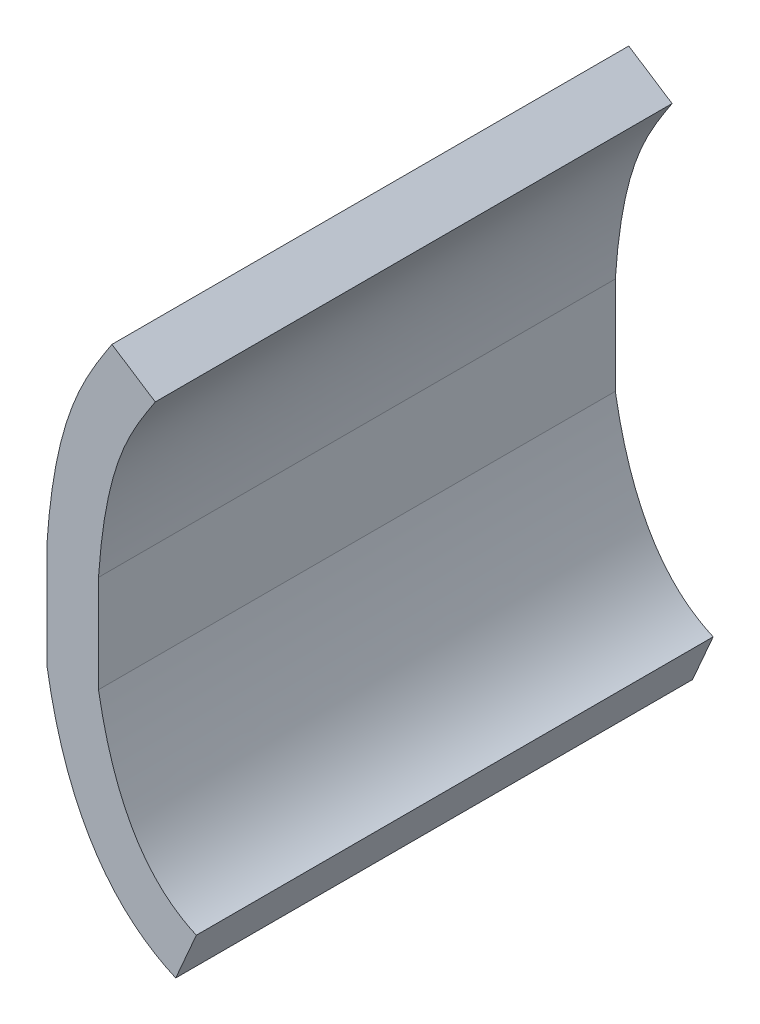
ISO-10303-21;
HEADER;
FILE_DESCRIPTION(('STEP AP214'),'2;1');
FILE_NAME('part.step','',(''),(''),'','','');
FILE_SCHEMA(('AUTOMOTIVE_DESIGN { 1 0 10303 214 1 1 1 1 }'));
ENDSEC;
DATA;
#1=APPLICATION_CONTEXT('core data for automotive mechanical design processes');
#2=APPLICATION_PROTOCOL_DEFINITION('international standard','automotive_design',2000,#1);
#3=PRODUCT_CONTEXT('',#1,'mechanical');
#4=PRODUCT('Part','Part','',(#3));
#5=PRODUCT_RELATED_PRODUCT_CATEGORY('part','',(#4));
#6=PRODUCT_DEFINITION_FORMATION('','',#4);
#7=PRODUCT_DEFINITION_CONTEXT('part definition',#1,'design');
#8=PRODUCT_DEFINITION('design','',#6,#7);
#9=PRODUCT_DEFINITION_SHAPE('','',#8);
#10=(LENGTH_UNIT() NAMED_UNIT(*) SI_UNIT(.MILLI.,.METRE.));
#11=(NAMED_UNIT(*) PLANE_ANGLE_UNIT() SI_UNIT($,.RADIAN.));
#12=(NAMED_UNIT(*) SI_UNIT($,.STERADIAN.) SOLID_ANGLE_UNIT());
#13=UNCERTAINTY_MEASURE_WITH_UNIT(LENGTH_MEASURE(1.E-05),#10,'distance_accuracy_value','');
#14=(GEOMETRIC_REPRESENTATION_CONTEXT(3) GLOBAL_UNCERTAINTY_ASSIGNED_CONTEXT((#13)) GLOBAL_UNIT_ASSIGNED_CONTEXT((#10,
#11,#12)) REPRESENTATION_CONTEXT('',''));
#15=CARTESIAN_POINT('',(0.,0.,0.));
#16=DIRECTION('',(0.,0.,1.));
#17=DIRECTION('',(1.,0.,0.));
#18=AXIS2_PLACEMENT_3D('',#15,#16,#17);
#19=CARTESIAN_POINT('',(9.86742604710632,-8.37706956252346,100.));
#20=CARTESIAN_POINT('',(9.96409645820732,-8.9648261973461,100.));
#21=CARTESIAN_POINT('',(10.1698483580487,-10.1496158152757,100.));
#22=CARTESIAN_POINT('',(10.6086328120167,-12.4235829047839,100.));
#23=CARTESIAN_POINT('',(11.2171597067933,-15.1473674178643,100.));
#24=CARTESIAN_POINT('',(12.0361971119047,-18.2058760921792,100.));
#25=CARTESIAN_POINT('',(13.2414210033886,-22.0101848533372,100.));
#26=CARTESIAN_POINT('',(14.9466249477142,-26.2495841866332,100.));
#27=CARTESIAN_POINT('',(17.2640492351609,-30.5295702277914,100.));
#28=CARTESIAN_POINT('',(19.8093937105364,-34.0487725145001,100.));
#29=CARTESIAN_POINT('',(22.5618897278353,-36.8865402753894,100.));
#30=CARTESIAN_POINT('',(25.0556144352368,-38.7691053073705,100.));
#31=CARTESIAN_POINT('',(27.2034695799206,-40.0243215208778,100.));
#32=CARTESIAN_POINT('',(28.3526827498363,-40.5787241147089,100.));
#33=CARTESIAN_POINT('',(28.9332643278208,-40.8315383684937,100.));
#34=B_SPLINE_CURVE_WITH_KNOTS('',3,(#19,#20,#21,#22,#23,#24,#25,#26,#27,#28,#29,#30,#31,#32,
#33),.UNSPECIFIED.,.F.,.F.,(4,1,1,1,1,1,1,1,1,1,1,1,4),(0.,0.03125,0.0625,0.125,0.1875,0.25,
0.375,0.5,0.625,0.75,0.875,0.9375,1.),.UNSPECIFIED.);
#35=DIRECTION('',(0.,0.,-1.));
#36=VECTOR('',#35,1.);
#37=SURFACE_OF_LINEAR_EXTRUSION('',#34,#36);
#38=CARTESIAN_POINT('',(9.86742604710632,-8.37706956252346,0.));
#39=CARTESIAN_POINT('',(9.96409645820732,-8.9648261973461,0.));
#40=CARTESIAN_POINT('',(10.1698483580487,-10.1496158152757,0.));
#41=CARTESIAN_POINT('',(10.6086328120167,-12.4235829047839,0.));
#42=CARTESIAN_POINT('',(11.2171597067933,-15.1473674178643,0.));
#43=CARTESIAN_POINT('',(12.0361971119047,-18.2058760921792,0.));
#44=CARTESIAN_POINT('',(13.2414210033886,-22.0101848533372,0.));
#45=CARTESIAN_POINT('',(14.9466249477142,-26.2495841866332,0.));
#46=CARTESIAN_POINT('',(17.2640492351609,-30.5295702277914,0.));
#47=CARTESIAN_POINT('',(19.8093937105364,-34.0487725145001,0.));
#48=CARTESIAN_POINT('',(22.5618897278353,-36.8865402753894,0.));
#49=CARTESIAN_POINT('',(25.0556144352368,-38.7691053073705,0.));
#50=CARTESIAN_POINT('',(27.2034695799206,-40.0243215208778,0.));
#51=CARTESIAN_POINT('',(28.3526827498363,-40.5787241147089,0.));
#52=CARTESIAN_POINT('',(28.9332643278208,-40.8315383684937,0.));
#53=B_SPLINE_CURVE_WITH_KNOTS('',3,(#38,#39,#40,#41,#42,#43,#44,#45,#46,#47,#48,#49,#50,#51,
#52),.UNSPECIFIED.,.F.,.F.,(4,1,1,1,1,1,1,1,1,1,1,1,4),(0.,0.03125,0.0625,0.125,0.1875,0.25,
0.375,0.5,0.625,0.75,0.875,0.9375,1.),.UNSPECIFIED.);
#54=CARTESIAN_POINT('',(10.,-9.16347415566861,0.));
#55=VERTEX_POINT('',#54);
#56=CARTESIAN_POINT('',(28.9332643278208,-40.8315383684937,0.));
#57=VERTEX_POINT('',#56);
#58=EDGE_CURVE('E183',#55,#57,#53,.T.);
#59=ORIENTED_EDGE('',*,*,#58,.F.);
#60=DIRECTION('',(0.,0.,-1.));
#61=VECTOR('',#60,1.);
#62=CARTESIAN_POINT('',(10.,-9.16347415566861,100.));
#63=LINE('',#62,#61);
#64=CARTESIAN_POINT('',(10.,-9.16347415566861,100.));
#65=VERTEX_POINT('',#64);
#66=EDGE_CURVE('E11',#65,#55,#63,.T.);
#67=ORIENTED_EDGE('',*,*,#66,.F.);
#68=CARTESIAN_POINT('',(28.9332643278208,-40.8315383684937,100.));
#69=VERTEX_POINT('',#68);
#70=EDGE_CURVE('E215',#65,#69,#34,.T.);
#71=ORIENTED_EDGE('',*,*,#70,.T.);
#72=DIRECTION('',(0.,0.,-1.));
#73=VECTOR('',#72,1.);
#74=CARTESIAN_POINT('',(28.9332643278208,-40.8315383684937,100.));
#75=LINE('',#74,#73);
#76=EDGE_CURVE('E85',#69,#57,#75,.T.);
#77=ORIENTED_EDGE('',*,*,#76,.T.);
#78=EDGE_LOOP('',(#59,#67,#71,#77));
#79=FACE_BOUND('',#78,.T.);
#80=ADVANCED_FACE('F33',(#79),#37,.T.);
#81=CARTESIAN_POINT('',(10.,0.,100.));
#82=DIRECTION('',(1.,0.,0.));
#83=DIRECTION('',(0.,1.,0.));
#84=AXIS2_PLACEMENT_3D('',#81,#82,#83);
#85=PLANE('',#84);
#86=DIRECTION('',(0.,-1.,0.));
#87=VECTOR('',#86,1.);
#88=CARTESIAN_POINT('',(10.,0.,0.));
#89=LINE('',#88,#87);
#90=CARTESIAN_POINT('',(10.,9.66613227006949,0.));
#91=VERTEX_POINT('',#90);
#92=EDGE_CURVE('E176',#91,#55,#89,.T.);
#93=ORIENTED_EDGE('',*,*,#92,.F.);
#94=DIRECTION('',(0.,0.,-1.));
#95=VECTOR('',#94,1.);
#96=CARTESIAN_POINT('',(10.,9.66613227006949,100.));
#97=LINE('',#96,#95);
#98=CARTESIAN_POINT('',(10.,9.66613227006949,100.));
#99=VERTEX_POINT('',#98);
#100=EDGE_CURVE('E42',#99,#91,#97,.T.);
#101=ORIENTED_EDGE('',*,*,#100,.F.);
#102=DIRECTION('',(0.,-1.,0.));
#103=VECTOR('',#102,1.);
#104=CARTESIAN_POINT('',(10.,0.,100.));
#105=LINE('',#104,#103);
#106=EDGE_CURVE('E161',#99,#65,#105,.T.);
#107=ORIENTED_EDGE('',*,*,#106,.T.);
#108=ORIENTED_EDGE('',*,*,#66,.T.);
#109=EDGE_LOOP('',(#93,#101,#107,#108));
#110=FACE_BOUND('',#109,.T.);
#111=ADVANCED_FACE('F167',(#110),#85,.T.);
#112=CARTESIAN_POINT('',(10.,9.66613227006949,100.));
#113=CARTESIAN_POINT('',(10.0448324149002,10.3256682429929,100.));
#114=CARTESIAN_POINT('',(10.1453234127376,11.6652077754102,100.));
#115=CARTESIAN_POINT('',(10.3706563176726,14.1726126439676,100.));
#116=CARTESIAN_POINT('',(10.7031994458772,17.1096252881833,100.));
#117=CARTESIAN_POINT('',(11.1719323410062,20.302311995185,100.));
#118=CARTESIAN_POINT('',(11.8784812016708,24.159772501049,100.));
#119=CARTESIAN_POINT('',(12.8913031783133,28.2845382056715,100.));
#120=CARTESIAN_POINT('',(14.2508749700919,32.3312420104808,100.));
#121=CARTESIAN_POINT('',(15.7195330788236,35.7191517496341,100.));
#122=CARTESIAN_POINT('',(17.3017149685599,38.7102040855204,100.));
#123=CARTESIAN_POINT('',(18.7502935600307,41.0915884263448,100.));
#124=CARTESIAN_POINT('',(19.993631128792,43.0301597713987,100.));
#125=CARTESIAN_POINT('',(20.6576085878022,44.0498630488258,100.));
#126=CARTESIAN_POINT('',(20.9845469889443,44.553257800915,100.));
#127=B_SPLINE_CURVE_WITH_KNOTS('',3,(#112,#113,#114,#115,#116,#117,#118,#119,#120,#121,#122,
#123,#124,#125,#126),.UNSPECIFIED.,.F.,.F.,(4,1,1,1,1,1,1,1,1,1,1,1,4),(0.00493734535662992,
0.0360330533142352,0.0671287612718406,0.129320177187051,0.191511593102262,0.253703009017472,
0.378085840847894,0.502468672678315,0.626851504508736,0.751234336339157,0.875617168169579,
0.937808584084789,1.),.UNSPECIFIED.);
#128=DIRECTION('',(0.,0.,-1.));
#129=VECTOR('',#128,1.);
#130=SURFACE_OF_LINEAR_EXTRUSION('',#127,#129);
#131=CARTESIAN_POINT('',(10.,9.66613227006949,0.));
#132=CARTESIAN_POINT('',(10.0448324149002,10.3256682429929,0.));
#133=CARTESIAN_POINT('',(10.1453234127376,11.6652077754102,0.));
#134=CARTESIAN_POINT('',(10.3706563176726,14.1726126439676,0.));
#135=CARTESIAN_POINT('',(10.7031994458772,17.1096252881833,0.));
#136=CARTESIAN_POINT('',(11.1719323410062,20.302311995185,0.));
#137=CARTESIAN_POINT('',(11.8784812016708,24.159772501049,0.));
#138=CARTESIAN_POINT('',(12.8913031783133,28.2845382056715,0.));
#139=CARTESIAN_POINT('',(14.2508749700919,32.3312420104808,0.));
#140=CARTESIAN_POINT('',(15.7195330788236,35.7191517496341,0.));
#141=CARTESIAN_POINT('',(17.3017149685599,38.7102040855204,0.));
#142=CARTESIAN_POINT('',(18.7502935600307,41.0915884263448,0.));
#143=CARTESIAN_POINT('',(19.993631128792,43.0301597713987,0.));
#144=CARTESIAN_POINT('',(20.6576085878022,44.0498630488258,0.));
#145=CARTESIAN_POINT('',(20.9845469889443,44.553257800915,0.));
#146=B_SPLINE_CURVE_WITH_KNOTS('',3,(#131,#132,#133,#134,#135,#136,#137,#138,#139,#140,#141,
#142,#143,#144,#145),.UNSPECIFIED.,.F.,.F.,(4,1,1,1,1,1,1,1,1,1,1,1,4),(0.00493734535662992,
0.0360330533142352,0.0671287612718406,0.129320177187051,0.191511593102262,0.253703009017472,
0.378085840847894,0.502468672678315,0.626851504508736,0.751234336339157,0.875617168169579,
0.937808584084789,1.),.UNSPECIFIED.);
#147=CARTESIAN_POINT('',(20.9845469889443,44.553257800915,0.));
#148=VERTEX_POINT('',#147);
#149=EDGE_CURVE('E182',#91,#148,#146,.T.);
#150=ORIENTED_EDGE('',*,*,#149,.T.);
#151=DIRECTION('',(0.,0.,-1.));
#152=VECTOR('',#151,1.);
#153=CARTESIAN_POINT('',(20.9845469889443,44.553257800915,100.));
#154=LINE('',#153,#152);
#155=CARTESIAN_POINT('',(20.9845469889443,44.553257800915,100.));
#156=VERTEX_POINT('',#155);
#157=EDGE_CURVE('E221',#156,#148,#154,.T.);
#158=ORIENTED_EDGE('',*,*,#157,.F.);
#159=EDGE_CURVE('E156',#99,#156,#127,.T.);
#160=ORIENTED_EDGE('',*,*,#159,.F.);
#161=ORIENTED_EDGE('',*,*,#100,.T.);
#162=EDGE_LOOP('',(#150,#158,#160,#161));
#163=FACE_BOUND('',#162,.T.);
#164=ADVANCED_FACE('F165',(#163),#130,.F.);
#165=CARTESIAN_POINT('',(26.5769590119882,40.9211693896761,100.));
#166=DIRECTION('',(0.544674219908499,0.838647717559088,0.));
#167=DIRECTION('',(-0.838647717559088,0.544674219908499,0.));
#168=AXIS2_PLACEMENT_3D('',#165,#166,#167);
#169=PLANE('',#168);
#170=DIRECTION('',(0.838647717559088,-0.544674219908499,0.));
#171=VECTOR('',#170,1.);
#172=CARTESIAN_POINT('',(26.5769590119882,40.9211693896761,0.));
#173=LINE('',#172,#171);
#174=CARTESIAN_POINT('',(12.5980698133534,50.,0.));
#175=VERTEX_POINT('',#174);
#176=EDGE_CURVE('E186',#175,#148,#173,.T.);
#177=ORIENTED_EDGE('',*,*,#176,.F.);
#178=DIRECTION('',(0.,0.,-1.));
#179=VECTOR('',#178,1.);
#180=CARTESIAN_POINT('',(12.5980698133534,50.,100.));
#181=LINE('',#180,#179);
#182=CARTESIAN_POINT('',(12.5980698133534,50.,100.));
#183=VERTEX_POINT('',#182);
#184=EDGE_CURVE('E219',#183,#175,#181,.T.);
#185=ORIENTED_EDGE('',*,*,#184,.F.);
#186=DIRECTION('',(0.838647717559088,-0.544674219908499,0.));
#187=VECTOR('',#186,1.);
#188=CARTESIAN_POINT('',(26.5769590119882,40.9211693896761,100.));
#189=LINE('',#188,#187);
#190=EDGE_CURVE('E150',#183,#156,#189,.T.);
#191=ORIENTED_EDGE('',*,*,#190,.T.);
#192=ORIENTED_EDGE('',*,*,#157,.T.);
#193=EDGE_LOOP('',(#177,#185,#191,#192));
#194=FACE_BOUND('',#193,.T.);
#195=ADVANCED_FACE('F143',(#194),#169,.T.);
#196=CARTESIAN_POINT('',(0.,10.,100.));
#197=CARTESIAN_POINT('',(1.5335153768986,33.3191512820151,100.));
#198=CARTESIAN_POINT('',(7.30316676755028,41.8473131428812,100.));
#199=CARTESIAN_POINT('',(12.5980698133534,50.,100.));
#200=B_SPLINE_CURVE_WITH_KNOTS('',3,(#196,#197,#198,#199),.UNSPECIFIED.,.F.,.F.,(4,4),(0.,1.),.UNSPECIFIED.);
#201=DIRECTION('',(0.,0.,-1.));
#202=VECTOR('',#201,1.);
#203=SURFACE_OF_LINEAR_EXTRUSION('',#200,#202);
#204=CARTESIAN_POINT('',(0.,10.,0.));
#205=CARTESIAN_POINT('',(1.5335153768986,33.3191512820151,0.));
#206=CARTESIAN_POINT('',(7.30316676755028,41.8473131428812,0.));
#207=CARTESIAN_POINT('',(12.5980698133534,50.,0.));
#208=B_SPLINE_CURVE_WITH_KNOTS('',3,(#204,#205,#206,#207),.UNSPECIFIED.,.F.,.F.,(4,4),(0.,1.),.UNSPECIFIED.);
#209=CARTESIAN_POINT('',(0.,10.,0.));
#210=VERTEX_POINT('',#209);
#211=EDGE_CURVE('E198',#210,#175,#208,.T.);
#212=ORIENTED_EDGE('',*,*,#211,.F.);
#213=DIRECTION('',(0.,0.,-1.));
#214=VECTOR('',#213,1.);
#215=CARTESIAN_POINT('',(0.,10.,100.));
#216=LINE('',#215,#214);
#217=CARTESIAN_POINT('',(0.,10.,100.));
#218=VERTEX_POINT('',#217);
#219=EDGE_CURVE('E118',#218,#210,#216,.T.);
#220=ORIENTED_EDGE('',*,*,#219,.F.);
#221=EDGE_CURVE('E111',#218,#183,#200,.T.);
#222=ORIENTED_EDGE('',*,*,#221,.T.);
#223=ORIENTED_EDGE('',*,*,#184,.T.);
#224=EDGE_LOOP('',(#212,#220,#222,#223));
#225=FACE_BOUND('',#224,.T.);
#226=ADVANCED_FACE('F140',(#225),#203,.T.);
#227=CARTESIAN_POINT('',(0.,0.,100.));
#228=DIRECTION('',(1.,0.,0.));
#229=DIRECTION('',(0.,0.,-1.));
#230=AXIS2_PLACEMENT_3D('',#227,#228,#229);
#231=PLANE('',#230);
#232=DIRECTION('',(0.,-1.,0.));
#233=VECTOR('',#232,1.);
#234=CARTESIAN_POINT('',(0.,0.,0.));
#235=LINE('',#234,#233);
#236=CARTESIAN_POINT('',(0.,-10.,0.));
#237=VERTEX_POINT('',#236);
#238=EDGE_CURVE('E117',#210,#237,#235,.T.);
#239=ORIENTED_EDGE('',*,*,#238,.T.);
#240=DIRECTION('',(0.,0.,-1.));
#241=VECTOR('',#240,1.);
#242=CARTESIAN_POINT('',(0.,-10.,100.));
#243=LINE('',#242,#241);
#244=CARTESIAN_POINT('',(0.,-10.,100.));
#245=VERTEX_POINT('',#244);
#246=EDGE_CURVE('E114',#245,#237,#243,.T.);
#247=ORIENTED_EDGE('',*,*,#246,.F.);
#248=DIRECTION('',(0.,-1.,0.));
#249=VECTOR('',#248,1.);
#250=CARTESIAN_POINT('',(0.,0.,100.));
#251=LINE('',#250,#249);
#252=EDGE_CURVE('E104',#218,#245,#251,.T.);
#253=ORIENTED_EDGE('',*,*,#252,.F.);
#254=ORIENTED_EDGE('',*,*,#219,.T.);
#255=EDGE_LOOP('',(#239,#247,#253,#254));
#256=FACE_BOUND('',#255,.T.);
#257=ADVANCED_FACE('F115',(#256),#231,.F.);
#258=CARTESIAN_POINT('',(0.,-10.,100.));
#259=CARTESIAN_POINT('',(5.16240883128816,-41.387474281935,100.));
#260=CARTESIAN_POINT('',(24.9408576211341,-50.,100.));
#261=B_SPLINE_CURVE_WITH_KNOTS('',2,(#258,#259,#260),.UNSPECIFIED.,.F.,.F.,(3,3),(0.,1.),.UNSPECIFIED.);
#262=DIRECTION('',(0.,0.,-1.));
#263=VECTOR('',#262,1.);
#264=SURFACE_OF_LINEAR_EXTRUSION('',#261,#263);
#265=CARTESIAN_POINT('',(0.,-10.,0.));
#266=CARTESIAN_POINT('',(5.16240883128816,-41.387474281935,0.));
#267=CARTESIAN_POINT('',(24.9408576211341,-50.,0.));
#268=B_SPLINE_CURVE_WITH_KNOTS('',2,(#265,#266,#267),.UNSPECIFIED.,.F.,.F.,(3,3),(0.,1.),.UNSPECIFIED.);
#269=CARTESIAN_POINT('',(24.9408576211341,-50.,0.));
#270=VERTEX_POINT('',#269);
#271=EDGE_CURVE('E78',#237,#270,#268,.T.);
#272=ORIENTED_EDGE('',*,*,#271,.T.);
#273=DIRECTION('',(0.,0.,-1.));
#274=VECTOR('',#273,1.);
#275=CARTESIAN_POINT('',(24.9408576211341,-50.,100.));
#276=LINE('',#275,#274);
#277=CARTESIAN_POINT('',(24.9408576211341,-50.,100.));
#278=VERTEX_POINT('',#277);
#279=EDGE_CURVE('E119',#278,#270,#276,.T.);
#280=ORIENTED_EDGE('',*,*,#279,.F.);
#281=EDGE_CURVE('E108',#245,#278,#261,.T.);
#282=ORIENTED_EDGE('',*,*,#281,.F.);
#283=ORIENTED_EDGE('',*,*,#246,.T.);
#284=EDGE_LOOP('',(#272,#280,#282,#283));
#285=FACE_BOUND('',#284,.T.);
#286=ADVANCED_FACE('F121',(#285),#264,.F.);
#287=CARTESIAN_POINT('',(39.2675705349321,-17.0990639716731,100.));
#288=DIRECTION('',(-0.916846163150629,0.399240670668671,0.));
#289=DIRECTION('',(-0.399240670668671,-0.916846163150629,0.));
#290=AXIS2_PLACEMENT_3D('',#287,#288,#289);
#291=PLANE('',#290);
#292=DIRECTION('',(0.399240670668671,0.916846163150629,0.));
#293=VECTOR('',#292,1.);
#294=CARTESIAN_POINT('',(39.2675705349321,-17.0990639716731,0.));
#295=LINE('',#294,#293);
#296=EDGE_CURVE('E210',#270,#57,#295,.T.);
#297=ORIENTED_EDGE('',*,*,#296,.T.);
#298=ORIENTED_EDGE('',*,*,#76,.F.);
#299=DIRECTION('',(0.399240670668671,0.916846163150629,0.));
#300=VECTOR('',#299,1.);
#301=CARTESIAN_POINT('',(39.2675705349321,-17.0990639716731,100.));
#302=LINE('',#301,#300);
#303=EDGE_CURVE('E50',#278,#69,#302,.T.);
#304=ORIENTED_EDGE('',*,*,#303,.F.);
#305=ORIENTED_EDGE('',*,*,#279,.T.);
#306=EDGE_LOOP('',(#297,#298,#304,#305));
#307=FACE_BOUND('',#306,.T.);
#308=ADVANCED_FACE('F136',(#307),#291,.F.);
#309=CARTESIAN_POINT('',(0.,0.,100.));
#310=DIRECTION('',(0.,0.,1.));
#311=DIRECTION('',(1.,0.,0.));
#312=AXIS2_PLACEMENT_3D('',#309,#310,#311);
#313=PLANE('',#312);
#314=ORIENTED_EDGE('',*,*,#70,.F.);
#315=ORIENTED_EDGE('',*,*,#106,.F.);
#316=ORIENTED_EDGE('',*,*,#159,.T.);
#317=ORIENTED_EDGE('',*,*,#190,.F.);
#318=ORIENTED_EDGE('',*,*,#221,.F.);
#319=ORIENTED_EDGE('',*,*,#252,.T.);
#320=ORIENTED_EDGE('',*,*,#281,.T.);
#321=ORIENTED_EDGE('',*,*,#303,.T.);
#322=EDGE_LOOP('',(#314,#315,#316,#317,#318,#319,#320,#321));
#323=FACE_BOUND('',#322,.T.);
#324=ADVANCED_FACE('F106',(#323),#313,.T.);
#325=CARTESIAN_POINT('',(0.,0.,0.));
#326=DIRECTION('',(0.,0.,1.));
#327=DIRECTION('',(1.,0.,0.));
#328=AXIS2_PLACEMENT_3D('',#325,#326,#327);
#329=PLANE('',#328);
#330=ORIENTED_EDGE('',*,*,#58,.T.);
#331=ORIENTED_EDGE('',*,*,#296,.F.);
#332=ORIENTED_EDGE('',*,*,#271,.F.);
#333=ORIENTED_EDGE('',*,*,#238,.F.);
#334=ORIENTED_EDGE('',*,*,#211,.T.);
#335=ORIENTED_EDGE('',*,*,#176,.T.);
#336=ORIENTED_EDGE('',*,*,#149,.F.);
#337=ORIENTED_EDGE('',*,*,#92,.T.);
#338=EDGE_LOOP('',(#330,#331,#332,#333,#334,#335,#336,#337));
#339=FACE_BOUND('',#338,.T.);
#340=ADVANCED_FACE('F224',(#339),#329,.F.);
#341=CLOSED_SHELL('',(#80,#111,#164,#195,#226,#257,#286,#308,#324,#340));
#342=MANIFOLD_SOLID_BREP('B2',#341);
#343=ADVANCED_BREP_SHAPE_REPRESENTATION('',(#18,#342),#14);
#344=SHAPE_DEFINITION_REPRESENTATION(#9,#343);
ENDSEC;
END-ISO-10303-21;
